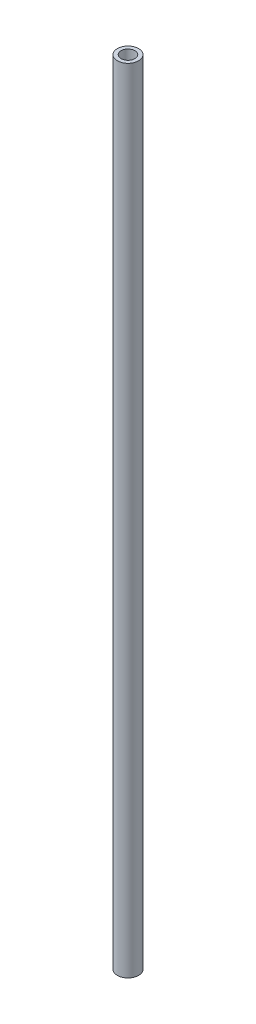
ISO-10303-21;
HEADER;
FILE_DESCRIPTION(('STEP AP214'),'2;1');
FILE_NAME('part.step','',(''),(''),'','','');
FILE_SCHEMA(('AUTOMOTIVE_DESIGN { 1 0 10303 214 1 1 1 1 }'));
ENDSEC;
DATA;
#1=APPLICATION_CONTEXT('core data for automotive mechanical design processes');
#2=APPLICATION_PROTOCOL_DEFINITION('international standard','automotive_design',2000,#1);
#3=PRODUCT_CONTEXT('',#1,'mechanical');
#4=PRODUCT('Part','Part','',(#3));
#5=PRODUCT_RELATED_PRODUCT_CATEGORY('part','',(#4));
#6=PRODUCT_DEFINITION_FORMATION('','',#4);
#7=PRODUCT_DEFINITION_CONTEXT('part definition',#1,'design');
#8=PRODUCT_DEFINITION('design','',#6,#7);
#9=PRODUCT_DEFINITION_SHAPE('','',#8);
#10=(LENGTH_UNIT() NAMED_UNIT(*) SI_UNIT(.MILLI.,.METRE.));
#11=(NAMED_UNIT(*) PLANE_ANGLE_UNIT() SI_UNIT($,.RADIAN.));
#12=(NAMED_UNIT(*) SI_UNIT($,.STERADIAN.) SOLID_ANGLE_UNIT());
#13=UNCERTAINTY_MEASURE_WITH_UNIT(LENGTH_MEASURE(1.E-05),#10,'distance_accuracy_value','');
#14=(GEOMETRIC_REPRESENTATION_CONTEXT(3) GLOBAL_UNCERTAINTY_ASSIGNED_CONTEXT((#13)) GLOBAL_UNIT_ASSIGNED_CONTEXT((#10,
#11,#12)) REPRESENTATION_CONTEXT('',''));
#15=CARTESIAN_POINT('',(0.,0.,0.));
#16=DIRECTION('',(0.,0.,1.));
#17=DIRECTION('',(1.,0.,0.));
#18=AXIS2_PLACEMENT_3D('',#15,#16,#17);
#19=CARTESIAN_POINT('',(0.,250.,0.));
#20=DIRECTION('',(0.,-1.,0.));
#21=DIRECTION('',(0.,0.,-1.));
#22=AXIS2_PLACEMENT_3D('',#19,#20,#21);
#23=CYLINDRICAL_SURFACE('',#22,3.35);
#24=CARTESIAN_POINT('',(0.,250.,0.));
#25=DIRECTION('',(0.,1.,0.));
#26=DIRECTION('',(0.,0.,1.));
#27=AXIS2_PLACEMENT_3D('',#24,#25,#26);
#28=CIRCLE('',#27,3.35);
#29=CARTESIAN_POINT('',(0.,250.,3.35));
#30=VERTEX_POINT('',#29);
#31=EDGE_CURVE('E10',#30,#30,#28,.T.);
#32=ORIENTED_EDGE('',*,*,#31,.F.);
#33=EDGE_LOOP('',(#32));
#34=FACE_BOUND('',#33,.T.);
#35=CARTESIAN_POINT('',(0.,0.,0.));
#36=DIRECTION('',(0.,1.,0.));
#37=DIRECTION('',(0.,0.,1.));
#38=AXIS2_PLACEMENT_3D('',#35,#36,#37);
#39=CIRCLE('',#38,3.35);
#40=CARTESIAN_POINT('',(0.,0.,3.35));
#41=VERTEX_POINT('',#40);
#42=EDGE_CURVE('E34',#41,#41,#39,.T.);
#43=ORIENTED_EDGE('',*,*,#42,.T.);
#44=EDGE_LOOP('',(#43));
#45=FACE_BOUND('',#44,.T.);
#46=ADVANCED_FACE('F31',(#34,#45),#23,.T.);
#47=CARTESIAN_POINT('',(0.,250.,0.));
#48=DIRECTION('',(0.,1.,0.));
#49=DIRECTION('',(0.,0.,1.));
#50=AXIS2_PLACEMENT_3D('',#47,#48,#49);
#51=PLANE('',#50);
#52=CARTESIAN_POINT('',(0.,250.,0.));
#53=DIRECTION('',(0.,1.,0.));
#54=DIRECTION('',(0.,0.,1.));
#55=AXIS2_PLACEMENT_3D('',#52,#53,#54);
#56=CIRCLE('',#55,2.1840114694669);
#57=CARTESIAN_POINT('',(0.,250.,2.1840114694669));
#58=VERTEX_POINT('',#57);
#59=EDGE_CURVE('E43',#58,#58,#56,.T.);
#60=ORIENTED_EDGE('',*,*,#59,.F.);
#61=EDGE_LOOP('',(#60));
#62=FACE_BOUND('',#61,.T.);
#63=ORIENTED_EDGE('',*,*,#31,.T.);
#64=EDGE_LOOP('',(#63));
#65=FACE_BOUND('',#64,.T.);
#66=ADVANCED_FACE('F58',(#62,#65),#51,.T.);
#67=CARTESIAN_POINT('',(0.,0.,0.));
#68=DIRECTION('',(0.,1.,0.));
#69=DIRECTION('',(0.,0.,1.));
#70=AXIS2_PLACEMENT_3D('',#67,#68,#69);
#71=PLANE('',#70);
#72=CARTESIAN_POINT('',(0.,0.,0.));
#73=DIRECTION('',(0.,1.,0.));
#74=DIRECTION('',(0.,0.,1.));
#75=AXIS2_PLACEMENT_3D('',#72,#73,#74);
#76=CIRCLE('',#75,2.1840114694669);
#77=CARTESIAN_POINT('',(0.,0.,2.1840114694669));
#78=VERTEX_POINT('',#77);
#79=EDGE_CURVE('E41',#78,#78,#76,.T.);
#80=ORIENTED_EDGE('',*,*,#79,.T.);
#81=EDGE_LOOP('',(#80));
#82=FACE_BOUND('',#81,.T.);
#83=ORIENTED_EDGE('',*,*,#42,.F.);
#84=EDGE_LOOP('',(#83));
#85=FACE_BOUND('',#84,.T.);
#86=ADVANCED_FACE('F49',(#82,#85),#71,.F.);
#87=CARTESIAN_POINT('',(0.,0.,0.));
#88=DIRECTION('',(0.,1.,0.));
#89=DIRECTION('',(0.,0.,1.));
#90=AXIS2_PLACEMENT_3D('',#87,#88,#89);
#91=CYLINDRICAL_SURFACE('',#90,2.1840114694669);
#92=ORIENTED_EDGE('',*,*,#79,.F.);
#93=EDGE_LOOP('',(#92));
#94=FACE_BOUND('',#93,.T.);
#95=ORIENTED_EDGE('',*,*,#59,.T.);
#96=EDGE_LOOP('',(#95));
#97=FACE_BOUND('',#96,.T.);
#98=ADVANCED_FACE('F52',(#94,#97),#91,.F.);
#99=CLOSED_SHELL('',(#46,#66,#86,#98));
#100=MANIFOLD_SOLID_BREP('B2',#99);
#101=ADVANCED_BREP_SHAPE_REPRESENTATION('',(#18,#100),#14);
#102=SHAPE_DEFINITION_REPRESENTATION(#9,#101);
ENDSEC;
END-ISO-10303-21;
